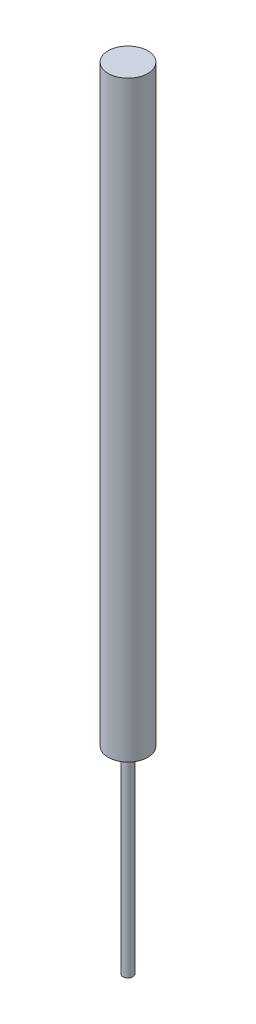
ISO-10303-21;
HEADER;
FILE_DESCRIPTION(('STEP AP214'),'2;1');
FILE_NAME('part.step','',(''),(''),'','','');
FILE_SCHEMA(('AUTOMOTIVE_DESIGN { 1 0 10303 214 1 1 1 1 }'));
ENDSEC;
DATA;
#1=APPLICATION_CONTEXT('core data for automotive mechanical design processes');
#2=APPLICATION_PROTOCOL_DEFINITION('international standard','automotive_design',2000,#1);
#3=PRODUCT_CONTEXT('',#1,'mechanical');
#4=PRODUCT('Part','Part','',(#3));
#5=PRODUCT_RELATED_PRODUCT_CATEGORY('part','',(#4));
#6=PRODUCT_DEFINITION_FORMATION('','',#4);
#7=PRODUCT_DEFINITION_CONTEXT('part definition',#1,'design');
#8=PRODUCT_DEFINITION('design','',#6,#7);
#9=PRODUCT_DEFINITION_SHAPE('','',#8);
#10=(LENGTH_UNIT() NAMED_UNIT(*) SI_UNIT(.MILLI.,.METRE.));
#11=(NAMED_UNIT(*) PLANE_ANGLE_UNIT() SI_UNIT($,.RADIAN.));
#12=(NAMED_UNIT(*) SI_UNIT($,.STERADIAN.) SOLID_ANGLE_UNIT());
#13=UNCERTAINTY_MEASURE_WITH_UNIT(LENGTH_MEASURE(1.E-05),#10,'distance_accuracy_value','');
#14=(GEOMETRIC_REPRESENTATION_CONTEXT(3) GLOBAL_UNCERTAINTY_ASSIGNED_CONTEXT((#13)) GLOBAL_UNIT_ASSIGNED_CONTEXT((#10,
#11,#12)) REPRESENTATION_CONTEXT('',''));
#15=CARTESIAN_POINT('',(0.,0.,0.));
#16=DIRECTION('',(0.,0.,1.));
#17=DIRECTION('',(1.,0.,0.));
#18=AXIS2_PLACEMENT_3D('',#15,#16,#17);
#19=CARTESIAN_POINT('',(0.,10.,0.));
#20=DIRECTION('',(0.,-1.,0.));
#21=DIRECTION('',(0.,0.,-1.));
#22=AXIS2_PLACEMENT_3D('',#19,#20,#21);
#23=CYLINDRICAL_SURFACE('',#22,0.25);
#24=CARTESIAN_POINT('',(0.,10.,0.));
#25=DIRECTION('',(0.,1.,0.));
#26=DIRECTION('',(0.,0.,1.));
#27=AXIS2_PLACEMENT_3D('',#24,#25,#26);
#28=CIRCLE('',#27,0.25);
#29=CARTESIAN_POINT('',(0.,10.,0.25));
#30=VERTEX_POINT('',#29);
#31=EDGE_CURVE('E10',#30,#30,#28,.T.);
#32=ORIENTED_EDGE('',*,*,#31,.F.);
#33=EDGE_LOOP('',(#32));
#34=FACE_BOUND('',#33,.T.);
#35=CARTESIAN_POINT('',(0.,0.,0.));
#36=DIRECTION('',(0.,1.,0.));
#37=DIRECTION('',(0.,0.,1.));
#38=AXIS2_PLACEMENT_3D('',#35,#36,#37);
#39=CIRCLE('',#38,0.25);
#40=CARTESIAN_POINT('',(0.,0.,0.25));
#41=VERTEX_POINT('',#40);
#42=EDGE_CURVE('E46',#41,#41,#39,.T.);
#43=ORIENTED_EDGE('',*,*,#42,.T.);
#44=EDGE_LOOP('',(#43));
#45=FACE_BOUND('',#44,.T.);
#46=ADVANCED_FACE('F43',(#34,#45),#23,.T.);
#47=CARTESIAN_POINT('',(0.,0.,0.));
#48=DIRECTION('',(0.,1.,0.));
#49=DIRECTION('',(0.,0.,1.));
#50=AXIS2_PLACEMENT_3D('',#47,#48,#49);
#51=PLANE('',#50);
#52=ORIENTED_EDGE('',*,*,#42,.F.);
#53=EDGE_LOOP('',(#52));
#54=FACE_BOUND('',#53,.T.);
#55=ADVANCED_FACE('F70',(#54),#51,.F.);
#56=CARTESIAN_POINT('',(0.,40.,0.));
#57=DIRECTION('',(0.,-1.,0.));
#58=DIRECTION('',(0.,0.,-1.));
#59=AXIS2_PLACEMENT_3D('',#56,#57,#58);
#60=CYLINDRICAL_SURFACE('',#59,1.);
#61=CARTESIAN_POINT('',(0.,40.,0.));
#62=DIRECTION('',(0.,1.,0.));
#63=DIRECTION('',(0.,0.,1.));
#64=AXIS2_PLACEMENT_3D('',#61,#62,#63);
#65=CIRCLE('',#64,1.);
#66=CARTESIAN_POINT('',(0.,40.,1.));
#67=VERTEX_POINT('',#66);
#68=EDGE_CURVE('E55',#67,#67,#65,.T.);
#69=ORIENTED_EDGE('',*,*,#68,.F.);
#70=EDGE_LOOP('',(#69));
#71=FACE_BOUND('',#70,.T.);
#72=CARTESIAN_POINT('',(0.,10.,0.));
#73=DIRECTION('',(0.,1.,0.));
#74=DIRECTION('',(0.,0.,1.));
#75=AXIS2_PLACEMENT_3D('',#72,#73,#74);
#76=CIRCLE('',#75,1.);
#77=CARTESIAN_POINT('',(0.,10.,1.));
#78=VERTEX_POINT('',#77);
#79=EDGE_CURVE('E57',#78,#78,#76,.T.);
#80=ORIENTED_EDGE('',*,*,#79,.T.);
#81=EDGE_LOOP('',(#80));
#82=FACE_BOUND('',#81,.T.);
#83=ADVANCED_FACE('F67',(#71,#82),#60,.T.);
#84=CARTESIAN_POINT('',(0.,40.,0.));
#85=DIRECTION('',(0.,1.,0.));
#86=DIRECTION('',(0.,0.,1.));
#87=AXIS2_PLACEMENT_3D('',#84,#85,#86);
#88=PLANE('',#87);
#89=ORIENTED_EDGE('',*,*,#68,.T.);
#90=EDGE_LOOP('',(#89));
#91=FACE_BOUND('',#90,.T.);
#92=ADVANCED_FACE('F65',(#91),#88,.T.);
#93=CARTESIAN_POINT('',(0.,10.,0.));
#94=DIRECTION('',(0.,1.,0.));
#95=DIRECTION('',(0.,0.,1.));
#96=AXIS2_PLACEMENT_3D('',#93,#94,#95);
#97=PLANE('',#96);
#98=ORIENTED_EDGE('',*,*,#31,.T.);
#99=EDGE_LOOP('',(#98));
#100=FACE_BOUND('',#99,.T.);
#101=ORIENTED_EDGE('',*,*,#79,.F.);
#102=EDGE_LOOP('',(#101));
#103=FACE_BOUND('',#102,.T.);
#104=ADVANCED_FACE('F74',(#100,#103),#97,.F.);
#105=CLOSED_SHELL('',(#46,#55,#83,#92,#104));
#106=MANIFOLD_SOLID_BREP('B2',#105);
#107=ADVANCED_BREP_SHAPE_REPRESENTATION('',(#18,#106),#14);
#108=SHAPE_DEFINITION_REPRESENTATION(#9,#107);
ENDSEC;
END-ISO-10303-21;
